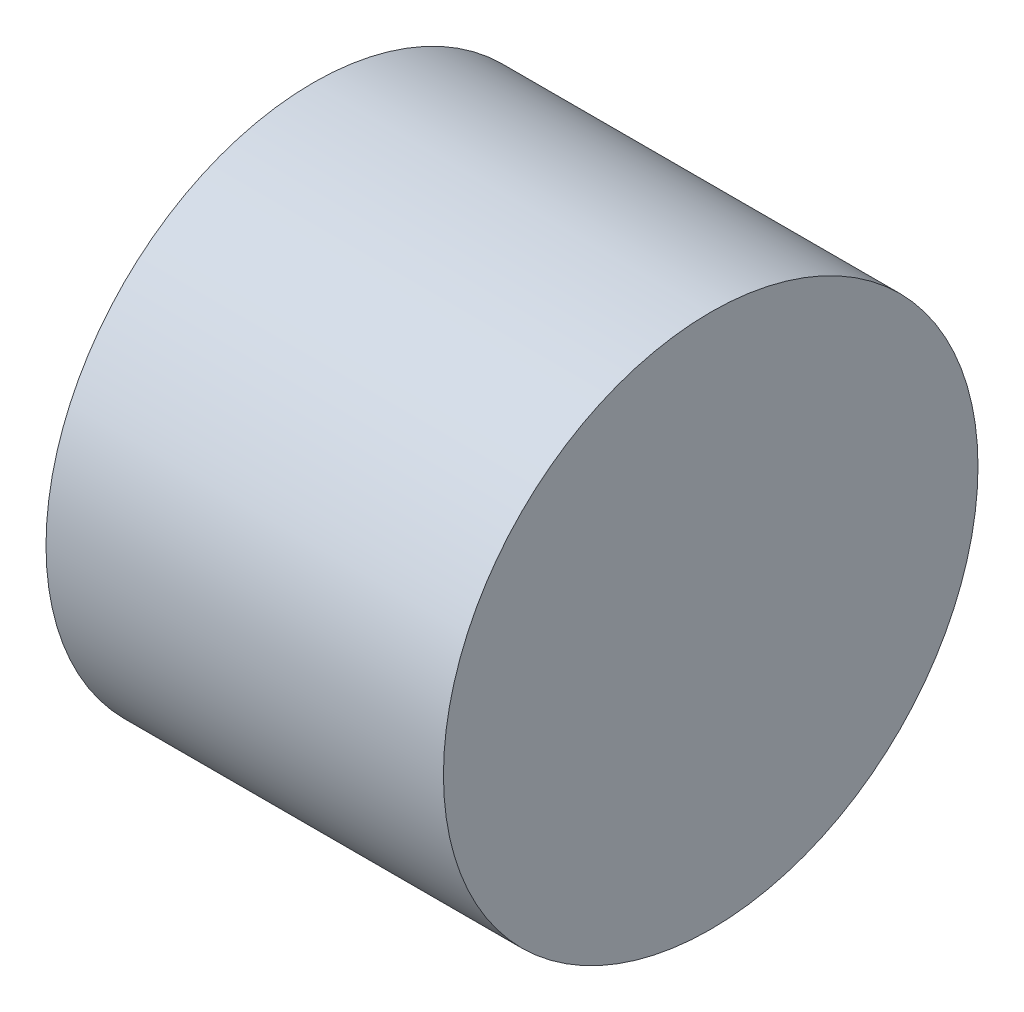
ISO-10303-21;
HEADER;
FILE_DESCRIPTION(('STEP AP214'),'2;1');
FILE_NAME('part.step','',(''),(''),'','','');
FILE_SCHEMA(('AUTOMOTIVE_DESIGN { 1 0 10303 214 1 1 1 1 }'));
ENDSEC;
DATA;
#1=APPLICATION_CONTEXT('core data for automotive mechanical design processes');
#2=APPLICATION_PROTOCOL_DEFINITION('international standard','automotive_design',2000,#1);
#3=PRODUCT_CONTEXT('',#1,'mechanical');
#4=PRODUCT('Part','Part','',(#3));
#5=PRODUCT_RELATED_PRODUCT_CATEGORY('part','',(#4));
#6=PRODUCT_DEFINITION_FORMATION('','',#4);
#7=PRODUCT_DEFINITION_CONTEXT('part definition',#1,'design');
#8=PRODUCT_DEFINITION('design','',#6,#7);
#9=PRODUCT_DEFINITION_SHAPE('','',#8);
#10=(LENGTH_UNIT() NAMED_UNIT(*) SI_UNIT(.MILLI.,.METRE.));
#11=(NAMED_UNIT(*) PLANE_ANGLE_UNIT() SI_UNIT($,.RADIAN.));
#12=(NAMED_UNIT(*) SI_UNIT($,.STERADIAN.) SOLID_ANGLE_UNIT());
#13=UNCERTAINTY_MEASURE_WITH_UNIT(LENGTH_MEASURE(1.E-05),#10,'distance_accuracy_value','');
#14=(GEOMETRIC_REPRESENTATION_CONTEXT(3) GLOBAL_UNCERTAINTY_ASSIGNED_CONTEXT((#13)) GLOBAL_UNIT_ASSIGNED_CONTEXT((#10,
#11,#12)) REPRESENTATION_CONTEXT('',''));
#15=CARTESIAN_POINT('',(0.,0.,0.));
#16=DIRECTION('',(0.,0.,1.));
#17=DIRECTION('',(1.,0.,0.));
#18=AXIS2_PLACEMENT_3D('',#15,#16,#17);
#19=CARTESIAN_POINT('',(-3000.,0.,0.));
#20=DIRECTION('',(-1.,0.,0.));
#21=DIRECTION('',(0.,0.,1.));
#22=AXIS2_PLACEMENT_3D('',#19,#20,#21);
#23=CYLINDRICAL_SURFACE('',#22,9.);
#24=CARTESIAN_POINT('',(1104.,0.,0.));
#25=DIRECTION('',(-1.,0.,0.));
#26=DIRECTION('',(0.,0.,1.));
#27=AXIS2_PLACEMENT_3D('',#24,#25,#26);
#28=CIRCLE('',#27,9.);
#29=CARTESIAN_POINT('',(1104.,0.,9.));
#30=VERTEX_POINT('',#29);
#31=EDGE_CURVE('E52',#30,#30,#28,.T.);
#32=ORIENTED_EDGE('',*,*,#31,.F.);
#33=EDGE_LOOP('',(#32));
#34=FACE_BOUND('',#33,.T.);
#35=CARTESIAN_POINT('',(1090.,0.,0.));
#36=DIRECTION('',(-1.,0.,0.));
#37=DIRECTION('',(0.,0.,1.));
#38=AXIS2_PLACEMENT_3D('',#35,#36,#37);
#39=CIRCLE('',#38,9.);
#40=CARTESIAN_POINT('',(1090.,0.,9.));
#41=VERTEX_POINT('',#40);
#42=EDGE_CURVE('E10',#41,#41,#39,.T.);
#43=ORIENTED_EDGE('',*,*,#42,.T.);
#44=EDGE_LOOP('',(#43));
#45=FACE_BOUND('',#44,.T.);
#46=ADVANCED_FACE('F39',(#34,#45),#23,.F.);
#47=CARTESIAN_POINT('',(1090.,9.,0.));
#48=DIRECTION('',(1.,0.,0.));
#49=DIRECTION('',(0.,0.,-1.));
#50=AXIS2_PLACEMENT_3D('',#47,#48,#49);
#51=PLANE('',#50);
#52=ORIENTED_EDGE('',*,*,#42,.F.);
#53=EDGE_LOOP('',(#52));
#54=FACE_BOUND('',#53,.T.);
#55=CARTESIAN_POINT('',(1090.,0.,0.));
#56=DIRECTION('',(-1.,0.,0.));
#57=DIRECTION('',(0.,0.,1.));
#58=AXIS2_PLACEMENT_3D('',#55,#56,#57);
#59=CIRCLE('',#58,13.45);
#60=CARTESIAN_POINT('',(1090.,0.,13.45));
#61=VERTEX_POINT('',#60);
#62=EDGE_CURVE('E44',#61,#61,#59,.T.);
#63=ORIENTED_EDGE('',*,*,#62,.T.);
#64=EDGE_LOOP('',(#63));
#65=FACE_BOUND('',#64,.T.);
#66=ADVANCED_FACE('F65',(#54,#65),#51,.F.);
#67=CARTESIAN_POINT('',(-3000.,0.,0.));
#68=DIRECTION('',(-1.,0.,0.));
#69=DIRECTION('',(0.,0.,1.));
#70=AXIS2_PLACEMENT_3D('',#67,#68,#69);
#71=CYLINDRICAL_SURFACE('',#70,13.45);
#72=ORIENTED_EDGE('',*,*,#62,.F.);
#73=EDGE_LOOP('',(#72));
#74=FACE_BOUND('',#73,.T.);
#75=CARTESIAN_POINT('',(1110.,0.,0.));
#76=DIRECTION('',(-1.,0.,0.));
#77=DIRECTION('',(0.,0.,1.));
#78=AXIS2_PLACEMENT_3D('',#75,#76,#77);
#79=CIRCLE('',#78,13.45);
#80=CARTESIAN_POINT('',(1110.,0.,13.45));
#81=VERTEX_POINT('',#80);
#82=EDGE_CURVE('E47',#81,#81,#79,.T.);
#83=ORIENTED_EDGE('',*,*,#82,.T.);
#84=EDGE_LOOP('',(#83));
#85=FACE_BOUND('',#84,.T.);
#86=ADVANCED_FACE('F66',(#74,#85),#71,.T.);
#87=CARTESIAN_POINT('',(1110.,13.45,0.));
#88=DIRECTION('',(-1.,0.,0.));
#89=DIRECTION('',(0.,0.,1.));
#90=AXIS2_PLACEMENT_3D('',#87,#88,#89);
#91=PLANE('',#90);
#92=ORIENTED_EDGE('',*,*,#82,.F.);
#93=EDGE_LOOP('',(#92));
#94=FACE_BOUND('',#93,.T.);
#95=ADVANCED_FACE('F72',(#94),#91,.F.);
#96=CARTESIAN_POINT('',(1104.,0.,0.));
#97=DIRECTION('',(1.,0.,0.));
#98=DIRECTION('',(0.,0.,-1.));
#99=AXIS2_PLACEMENT_3D('',#96,#97,#98);
#100=PLANE('',#99);
#101=ORIENTED_EDGE('',*,*,#31,.T.);
#102=EDGE_LOOP('',(#101));
#103=FACE_BOUND('',#102,.T.);
#104=ADVANCED_FACE('F56',(#103),#100,.F.);
#105=CLOSED_SHELL('',(#46,#66,#86,#95,#104));
#106=MANIFOLD_SOLID_BREP('B2',#105);
#107=ADVANCED_BREP_SHAPE_REPRESENTATION('',(#18,#106),#14);
#108=SHAPE_DEFINITION_REPRESENTATION(#9,#107);
ENDSEC;
END-ISO-10303-21;
